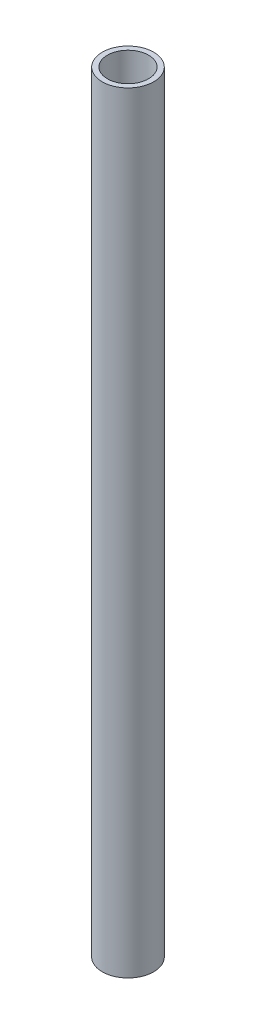
ISO-10303-21;
HEADER;
FILE_DESCRIPTION(('STEP AP214'),'2;1');
FILE_NAME('part.step','',(''),(''),'','','');
FILE_SCHEMA(('AUTOMOTIVE_DESIGN { 1 0 10303 214 1 1 1 1 }'));
ENDSEC;
DATA;
#1=APPLICATION_CONTEXT('core data for automotive mechanical design processes');
#2=APPLICATION_PROTOCOL_DEFINITION('international standard','automotive_design',2000,#1);
#3=PRODUCT_CONTEXT('',#1,'mechanical');
#4=PRODUCT('Part','Part','',(#3));
#5=PRODUCT_RELATED_PRODUCT_CATEGORY('part','',(#4));
#6=PRODUCT_DEFINITION_FORMATION('','',#4);
#7=PRODUCT_DEFINITION_CONTEXT('part definition',#1,'design');
#8=PRODUCT_DEFINITION('design','',#6,#7);
#9=PRODUCT_DEFINITION_SHAPE('','',#8);
#10=(LENGTH_UNIT() NAMED_UNIT(*) SI_UNIT(.MILLI.,.METRE.));
#11=(NAMED_UNIT(*) PLANE_ANGLE_UNIT() SI_UNIT($,.RADIAN.));
#12=(NAMED_UNIT(*) SI_UNIT($,.STERADIAN.) SOLID_ANGLE_UNIT());
#13=UNCERTAINTY_MEASURE_WITH_UNIT(LENGTH_MEASURE(1.E-05),#10,'distance_accuracy_value','');
#14=(GEOMETRIC_REPRESENTATION_CONTEXT(3) GLOBAL_UNCERTAINTY_ASSIGNED_CONTEXT((#13)) GLOBAL_UNIT_ASSIGNED_CONTEXT((#10,
#11,#12)) REPRESENTATION_CONTEXT('',''));
#15=CARTESIAN_POINT('',(0.,0.,0.));
#16=DIRECTION('',(0.,0.,1.));
#17=DIRECTION('',(1.,0.,0.));
#18=AXIS2_PLACEMENT_3D('',#15,#16,#17);
#19=CARTESIAN_POINT('',(0.,150.,0.));
#20=DIRECTION('',(0.,1.,0.));
#21=DIRECTION('',(0.,0.,1.));
#22=AXIS2_PLACEMENT_3D('',#19,#20,#21);
#23=PLANE('',#22);
#24=CARTESIAN_POINT('',(0.,150.,0.));
#25=DIRECTION('',(0.,1.,0.));
#26=DIRECTION('',(0.,0.,1.));
#27=AXIS2_PLACEMENT_3D('',#24,#25,#26);
#28=CIRCLE('',#27,5.);
#29=CARTESIAN_POINT('',(0.,150.,5.));
#30=VERTEX_POINT('',#29);
#31=EDGE_CURVE('E10',#30,#30,#28,.T.);
#32=ORIENTED_EDGE('',*,*,#31,.T.);
#33=EDGE_LOOP('',(#32));
#34=FACE_BOUND('',#33,.T.);
#35=CARTESIAN_POINT('',(0.,150.,0.));
#36=DIRECTION('',(0.,1.,0.));
#37=DIRECTION('',(0.,0.,1.));
#38=AXIS2_PLACEMENT_3D('',#35,#36,#37);
#39=CIRCLE('',#38,4.);
#40=CARTESIAN_POINT('',(0.,150.,4.));
#41=VERTEX_POINT('',#40);
#42=EDGE_CURVE('E50',#41,#41,#39,.T.);
#43=ORIENTED_EDGE('',*,*,#42,.F.);
#44=EDGE_LOOP('',(#43));
#45=FACE_BOUND('',#44,.T.);
#46=ADVANCED_FACE('F39',(#34,#45),#23,.T.);
#47=CARTESIAN_POINT('',(0.,0.,0.));
#48=DIRECTION('',(0.,1.,0.));
#49=DIRECTION('',(0.,0.,1.));
#50=AXIS2_PLACEMENT_3D('',#47,#48,#49);
#51=PLANE('',#50);
#52=CARTESIAN_POINT('',(0.,0.,0.));
#53=DIRECTION('',(0.,1.,0.));
#54=DIRECTION('',(0.,0.,1.));
#55=AXIS2_PLACEMENT_3D('',#52,#53,#54);
#56=CIRCLE('',#55,5.);
#57=CARTESIAN_POINT('',(0.,0.,5.));
#58=VERTEX_POINT('',#57);
#59=EDGE_CURVE('E43',#58,#58,#56,.T.);
#60=ORIENTED_EDGE('',*,*,#59,.F.);
#61=EDGE_LOOP('',(#60));
#62=FACE_BOUND('',#61,.T.);
#63=CARTESIAN_POINT('',(0.,0.,0.));
#64=DIRECTION('',(0.,1.,0.));
#65=DIRECTION('',(0.,0.,1.));
#66=AXIS2_PLACEMENT_3D('',#63,#64,#65);
#67=CIRCLE('',#66,4.);
#68=CARTESIAN_POINT('',(0.,0.,4.));
#69=VERTEX_POINT('',#68);
#70=EDGE_CURVE('E52',#69,#69,#67,.T.);
#71=ORIENTED_EDGE('',*,*,#70,.T.);
#72=EDGE_LOOP('',(#71));
#73=FACE_BOUND('',#72,.T.);
#74=ADVANCED_FACE('F62',(#62,#73),#51,.F.);
#75=CARTESIAN_POINT('',(0.,150.,0.));
#76=DIRECTION('',(0.,-1.,0.));
#77=DIRECTION('',(0.,0.,-1.));
#78=AXIS2_PLACEMENT_3D('',#75,#76,#77);
#79=CYLINDRICAL_SURFACE('',#78,5.);
#80=ORIENTED_EDGE('',*,*,#31,.F.);
#81=EDGE_LOOP('',(#80));
#82=FACE_BOUND('',#81,.T.);
#83=ORIENTED_EDGE('',*,*,#59,.T.);
#84=EDGE_LOOP('',(#83));
#85=FACE_BOUND('',#84,.T.);
#86=ADVANCED_FACE('F41',(#82,#85),#79,.T.);
#87=CARTESIAN_POINT('',(0.,150.,0.));
#88=DIRECTION('',(0.,-1.,0.));
#89=DIRECTION('',(0.,0.,-1.));
#90=AXIS2_PLACEMENT_3D('',#87,#88,#89);
#91=CYLINDRICAL_SURFACE('',#90,4.);
#92=ORIENTED_EDGE('',*,*,#42,.T.);
#93=EDGE_LOOP('',(#92));
#94=FACE_BOUND('',#93,.T.);
#95=ORIENTED_EDGE('',*,*,#70,.F.);
#96=EDGE_LOOP('',(#95));
#97=FACE_BOUND('',#96,.T.);
#98=ADVANCED_FACE('F58',(#94,#97),#91,.F.);
#99=CLOSED_SHELL('',(#46,#74,#86,#98));
#100=MANIFOLD_SOLID_BREP('B2',#99);
#101=ADVANCED_BREP_SHAPE_REPRESENTATION('',(#18,#100),#14);
#102=SHAPE_DEFINITION_REPRESENTATION(#9,#101);
ENDSEC;
END-ISO-10303-21;
